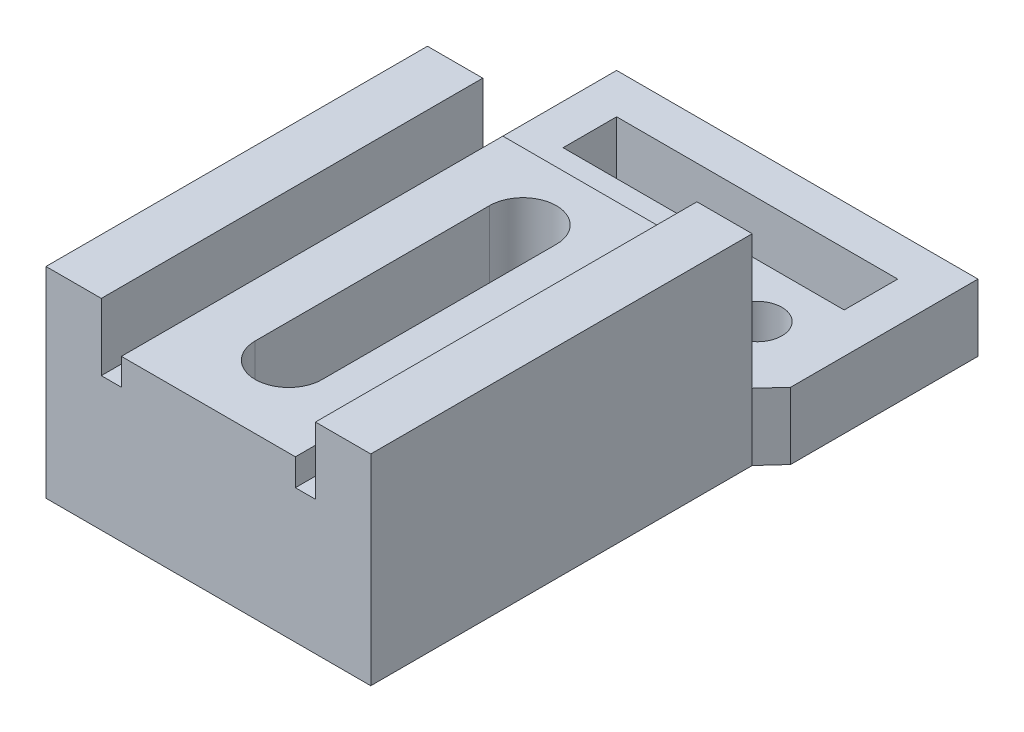
ISO-10303-21;
HEADER;
FILE_DESCRIPTION(('STEP AP214'),'2;1');
FILE_NAME('part.step','',(''),(''),'','','');
FILE_SCHEMA(('AUTOMOTIVE_DESIGN { 1 0 10303 214 1 1 1 1 }'));
ENDSEC;
DATA;
#1=APPLICATION_CONTEXT('core data for automotive mechanical design processes');
#2=APPLICATION_PROTOCOL_DEFINITION('international standard','automotive_design',2000,#1);
#3=PRODUCT_CONTEXT('',#1,'mechanical');
#4=PRODUCT('Part','Part','',(#3));
#5=PRODUCT_RELATED_PRODUCT_CATEGORY('part','',(#4));
#6=PRODUCT_DEFINITION_FORMATION('','',#4);
#7=PRODUCT_DEFINITION_CONTEXT('part definition',#1,'design');
#8=PRODUCT_DEFINITION('design','',#6,#7);
#9=PRODUCT_DEFINITION_SHAPE('','',#8);
#10=(LENGTH_UNIT() NAMED_UNIT(*) SI_UNIT(.MILLI.,.METRE.));
#11=(NAMED_UNIT(*) PLANE_ANGLE_UNIT() SI_UNIT($,.RADIAN.));
#12=(NAMED_UNIT(*) SI_UNIT($,.STERADIAN.) SOLID_ANGLE_UNIT());
#13=UNCERTAINTY_MEASURE_WITH_UNIT(LENGTH_MEASURE(1.E-05),#10,'distance_accuracy_value','');
#14=(GEOMETRIC_REPRESENTATION_CONTEXT(3) GLOBAL_UNCERTAINTY_ASSIGNED_CONTEXT((#13)) GLOBAL_UNIT_ASSIGNED_CONTEXT((#10,
#11,#12)) REPRESENTATION_CONTEXT('',''));
#15=CARTESIAN_POINT('',(0.,0.,0.));
#16=DIRECTION('',(0.,0.,1.));
#17=DIRECTION('',(1.,0.,0.));
#18=AXIS2_PLACEMENT_3D('',#15,#16,#17);
#19=CARTESIAN_POINT('',(4.501,-3.15116720260804,-78.1616330776864));
#20=DIRECTION('',(0.,0.,1.));
#21=DIRECTION('',(1.,0.,0.));
#22=AXIS2_PLACEMENT_3D('',#19,#20,#21);
#23=PLANE('',#22);
#24=DIRECTION('',(0.,1.,0.));
#25=VECTOR('',#24,1.);
#26=CARTESIAN_POINT('',(3.13183387502036,-36.8227277360133,-78.1616330776864));
#27=LINE('',#26,#25);
#28=CARTESIAN_POINT('',(3.13183387502036,-3.15116720260804,-78.1616330776864));
#29=VERTEX_POINT('',#28);
#30=CARTESIAN_POINT('',(3.13183387502036,6.84883279739195,-78.1616330776864));
#31=VERTEX_POINT('',#30);
#32=EDGE_CURVE('E233',#29,#31,#27,.T.);
#33=ORIENTED_EDGE('',*,*,#32,.F.);
#34=DIRECTION('',(-1.,0.,0.));
#35=VECTOR('',#34,1.);
#36=CARTESIAN_POINT('',(4.501,-3.15116720260804,-78.1616330776864));
#37=LINE('',#36,#35);
#38=CARTESIAN_POINT('',(-21.1318338750204,-3.15116720260804,-78.1616330776864));
#39=VERTEX_POINT('',#38);
#40=EDGE_CURVE('E59',#29,#39,#37,.T.);
#41=ORIENTED_EDGE('',*,*,#40,.T.);
#42=DIRECTION('',(0.,1.,0.));
#43=VECTOR('',#42,1.);
#44=CARTESIAN_POINT('',(-21.1318338750204,-36.8227277360133,-78.1616330776864));
#45=LINE('',#44,#43);
#46=CARTESIAN_POINT('',(-21.1318338750204,6.84883279739195,-78.1616330776864));
#47=VERTEX_POINT('',#46);
#48=EDGE_CURVE('E255',#39,#47,#45,.T.);
#49=ORIENTED_EDGE('',*,*,#48,.T.);
#50=DIRECTION('',(-1.,0.,0.));
#51=VECTOR('',#50,1.);
#52=CARTESIAN_POINT('',(4.501,6.84883279739196,-78.1616330776864));
#53=LINE('',#52,#51);
#54=CARTESIAN_POINT('',(-17.,6.84883279739196,-78.1616330776864));
#55=VERTEX_POINT('',#54);
#56=EDGE_CURVE('E263',#55,#47,#53,.T.);
#57=ORIENTED_EDGE('',*,*,#56,.F.);
#58=DIRECTION('',(0.,1.,0.));
#59=VECTOR('',#58,1.);
#60=CARTESIAN_POINT('',(-17.,-3.15116720260804,-78.1616330776864));
#61=LINE('',#60,#59);
#62=CARTESIAN_POINT('',(-17.,1.84883279739196,-78.1616330776864));
#63=VERTEX_POINT('',#62);
#64=EDGE_CURVE('E277',#63,#55,#61,.T.);
#65=ORIENTED_EDGE('',*,*,#64,.F.);
#66=DIRECTION('',(-1.,0.,0.));
#67=VECTOR('',#66,1.);
#68=CARTESIAN_POINT('',(-17.,1.84883279739196,-78.1616330776864));
#69=LINE('',#68,#67);
#70=CARTESIAN_POINT('',(-15.5,1.84883279739196,-78.1616330776864));
#71=VERTEX_POINT('',#70);
#72=EDGE_CURVE('E437',#71,#63,#69,.T.);
#73=ORIENTED_EDGE('',*,*,#72,.F.);
#74=DIRECTION('',(0.,1.,0.));
#75=VECTOR('',#74,1.);
#76=CARTESIAN_POINT('',(-15.5,1.84883279739196,-78.1616330776864));
#77=LINE('',#76,#75);
#78=CARTESIAN_POINT('',(-15.5,3.84883279739196,-78.1616330776864));
#79=VERTEX_POINT('',#78);
#80=EDGE_CURVE('E412',#71,#79,#77,.T.);
#81=ORIENTED_EDGE('',*,*,#80,.T.);
#82=DIRECTION('',(-1.,0.,0.));
#83=VECTOR('',#82,1.);
#84=CARTESIAN_POINT('',(4.501,3.84883279739196,-78.1616330776864));
#85=LINE('',#84,#83);
#86=CARTESIAN_POINT('',(-2.5,3.84883279739196,-78.1616330776864));
#87=VERTEX_POINT('',#86);
#88=EDGE_CURVE('E273',#87,#79,#85,.T.);
#89=ORIENTED_EDGE('',*,*,#88,.F.);
#90=DIRECTION('',(0.,1.,0.));
#91=VECTOR('',#90,1.);
#92=CARTESIAN_POINT('',(-2.5,1.84883279739196,-78.1616330776864));
#93=LINE('',#92,#91);
#94=CARTESIAN_POINT('',(-2.5,1.84883279739196,-78.1616330776864));
#95=VERTEX_POINT('',#94);
#96=EDGE_CURVE('E478',#95,#87,#93,.T.);
#97=ORIENTED_EDGE('',*,*,#96,.F.);
#98=DIRECTION('',(-1.,0.,0.));
#99=VECTOR('',#98,1.);
#100=CARTESIAN_POINT('',(-1.,1.84883279739196,-78.1616330776864));
#101=LINE('',#100,#99);
#102=CARTESIAN_POINT('',(-1.,1.84883279739196,-78.1616330776864));
#103=VERTEX_POINT('',#102);
#104=EDGE_CURVE('E465',#103,#95,#101,.T.);
#105=ORIENTED_EDGE('',*,*,#104,.F.);
#106=DIRECTION('',(0.,-1.,0.));
#107=VECTOR('',#106,1.);
#108=CARTESIAN_POINT('',(-1.,-3.15116720260804,-78.1616330776864));
#109=LINE('',#108,#107);
#110=CARTESIAN_POINT('',(-1.,6.84883279739196,-78.1616330776864));
#111=VERTEX_POINT('',#110);
#112=EDGE_CURVE('E270',#111,#103,#109,.T.);
#113=ORIENTED_EDGE('',*,*,#112,.F.);
#114=EDGE_CURVE('E267',#31,#111,#53,.T.);
#115=ORIENTED_EDGE('',*,*,#114,.F.);
#116=EDGE_LOOP('',(#33,#41,#49,#57,#65,#73,#81,#89,#97,#105,#113,#115));
#117=FACE_BOUND('',#116,.T.);
#118=ADVANCED_FACE('F43',(#117),#23,.F.);
#119=CARTESIAN_POINT('',(-1.,3.84883279739196,-79.6616330776864));
#120=DIRECTION('',(0.,1.,0.));
#121=DIRECTION('',(-1.,0.,0.));
#122=AXIS2_PLACEMENT_3D('',#119,#120,#121);
#123=PLANE('',#122);
#124=DIRECTION('',(0.,0.,-1.));
#125=VECTOR('',#124,1.);
#126=CARTESIAN_POINT('',(-15.5,3.84883279739196,-78.1616330776864));
#127=LINE('',#126,#125);
#128=CARTESIAN_POINT('',(-15.5,3.84883279739196,-49.6616330776864));
#129=VERTEX_POINT('',#128);
#130=EDGE_CURVE('E439',#129,#79,#127,.T.);
#131=ORIENTED_EDGE('',*,*,#130,.F.);
#132=DIRECTION('',(-1.,0.,0.));
#133=VECTOR('',#132,1.);
#134=CARTESIAN_POINT('',(-1.,3.84883279739196,-49.6616330776864));
#135=LINE('',#134,#133);
#136=CARTESIAN_POINT('',(-2.5,3.84883279739196,-49.6616330776864));
#137=VERTEX_POINT('',#136);
#138=EDGE_CURVE('E383',#137,#129,#135,.T.);
#139=ORIENTED_EDGE('',*,*,#138,.F.);
#140=DIRECTION('',(0.,0.,1.));
#141=VECTOR('',#140,1.);
#142=CARTESIAN_POINT('',(-2.5,3.84883279739196,-78.1616330776864));
#143=LINE('',#142,#141);
#144=EDGE_CURVE('E466',#87,#137,#143,.T.);
#145=ORIENTED_EDGE('',*,*,#144,.F.);
#146=ORIENTED_EDGE('',*,*,#88,.T.);
#147=EDGE_LOOP('',(#131,#139,#145,#146));
#148=FACE_BOUND('',#147,.T.);
#149=CARTESIAN_POINT('',(-9.,3.84883279739196,-55.6616330776864));
#150=DIRECTION('',(0.,1.,0.));
#151=DIRECTION('',(-1.,0.,0.));
#152=AXIS2_PLACEMENT_3D('',#149,#150,#151);
#153=CIRCLE('',#152,2.5);
#154=CARTESIAN_POINT('',(-6.5,3.84883279739196,-55.6616330776864));
#155=VERTEX_POINT('',#154);
#156=CARTESIAN_POINT('',(-11.5,3.84883279739196,-55.6616330776864));
#157=VERTEX_POINT('',#156);
#158=EDGE_CURVE('E586',#155,#157,#153,.F.);
#159=ORIENTED_EDGE('',*,*,#158,.T.);
#160=DIRECTION('',(0.,0.,1.));
#161=VECTOR('',#160,1.);
#162=CARTESIAN_POINT('',(-11.5,3.84883279739196,-79.6616330776864));
#163=LINE('',#162,#161);
#164=CARTESIAN_POINT('',(-11.5,3.84883279739196,-73.1616330776864));
#165=VERTEX_POINT('',#164);
#166=EDGE_CURVE('E448',#165,#157,#163,.T.);
#167=ORIENTED_EDGE('',*,*,#166,.F.);
#168=CARTESIAN_POINT('',(-9.,3.84883279739196,-73.1616330776864));
#169=DIRECTION('',(0.,1.,0.));
#170=DIRECTION('',(0.,0.,1.));
#171=AXIS2_PLACEMENT_3D('',#168,#169,#170);
#172=CIRCLE('',#171,2.5);
#173=CARTESIAN_POINT('',(-6.5,3.84883279739196,-73.1616330776864));
#174=VERTEX_POINT('',#173);
#175=EDGE_CURVE('E379',#174,#165,#172,.T.);
#176=ORIENTED_EDGE('',*,*,#175,.F.);
#177=DIRECTION('',(0.,0.,-1.));
#178=VECTOR('',#177,1.);
#179=CARTESIAN_POINT('',(-6.5,3.84883279739196,-79.6616330776864));
#180=LINE('',#179,#178);
#181=EDGE_CURVE('E603',#155,#174,#180,.T.);
#182=ORIENTED_EDGE('',*,*,#181,.F.);
#183=EDGE_LOOP('',(#159,#167,#176,#182));
#184=FACE_BOUND('',#183,.T.);
#185=ADVANCED_FACE('F493',(#148,#184),#123,.T.);
#186=CARTESIAN_POINT('',(0.,-8.15116720260804,0.));
#187=DIRECTION('',(0.,-1.,0.));
#188=DIRECTION('',(0.,0.,-1.));
#189=AXIS2_PLACEMENT_3D('',#186,#187,#188);
#190=PLANE('',#189);
#191=DIRECTION('',(0.673893454236287,0.,-0.738828540554224));
#192=VECTOR('',#191,1.);
#193=CARTESIAN_POINT('',(3.13183387502036,-8.15116720260804,-78.1616330776864));
#194=LINE('',#193,#192);
#195=CARTESIAN_POINT('',(3.13183387502036,-8.15116720260804,-78.1616330776864));
#196=VERTEX_POINT('',#195);
#197=CARTESIAN_POINT('',(4.5,-8.15116720260804,-79.6616330776864));
#198=VERTEX_POINT('',#197);
#199=EDGE_CURVE('E212',#196,#198,#194,.T.);
#200=ORIENTED_EDGE('',*,*,#199,.F.);
#201=DIRECTION('',(0.,0.,-1.));
#202=VECTOR('',#201,1.);
#203=CARTESIAN_POINT('',(3.13183387502036,-8.15116720260804,-49.6616330776864));
#204=LINE('',#203,#202);
#205=CARTESIAN_POINT('',(3.13183387502036,-8.15116720260804,-49.6616330776864));
#206=VERTEX_POINT('',#205);
#207=EDGE_CURVE('E217',#206,#196,#204,.T.);
#208=ORIENTED_EDGE('',*,*,#207,.F.);
#209=DIRECTION('',(-1.,0.,0.));
#210=VECTOR('',#209,1.);
#211=CARTESIAN_POINT('',(0.,-8.15116720260804,-49.6616330776864));
#212=LINE('',#211,#210);
#213=CARTESIAN_POINT('',(-21.1318338750204,-8.15116720260804,-49.6616330776864));
#214=VERTEX_POINT('',#213);
#215=EDGE_CURVE('E334',#206,#214,#212,.T.);
#216=ORIENTED_EDGE('',*,*,#215,.T.);
#217=DIRECTION('',(0.,0.,-1.));
#218=VECTOR('',#217,1.);
#219=CARTESIAN_POINT('',(-21.1318338750204,-8.15116720260804,-49.6616330776864));
#220=LINE('',#219,#218);
#221=CARTESIAN_POINT('',(-21.1318338750204,-8.15116720260804,-78.1616330776864));
#222=VERTEX_POINT('',#221);
#223=EDGE_CURVE('E244',#214,#222,#220,.T.);
#224=ORIENTED_EDGE('',*,*,#223,.T.);
#225=DIRECTION('',(0.673893454236287,0.,0.738828540554224));
#226=VECTOR('',#225,1.);
#227=CARTESIAN_POINT('',(-21.1318338750204,-8.15116720260804,-78.1616330776864));
#228=LINE('',#227,#226);
#229=CARTESIAN_POINT('',(-22.5,-8.15116720260804,-79.6616330776864));
#230=VERTEX_POINT('',#229);
#231=EDGE_CURVE('E576',#230,#222,#228,.T.);
#232=ORIENTED_EDGE('',*,*,#231,.F.);
#233=DIRECTION('',(0.,0.,1.));
#234=VECTOR('',#233,1.);
#235=CARTESIAN_POINT('',(-22.5,-8.15116720260804,0.));
#236=LINE('',#235,#234);
#237=CARTESIAN_POINT('',(-22.5,-8.15116720260804,-93.6616330776864));
#238=VERTEX_POINT('',#237);
#239=EDGE_CURVE('E325',#238,#230,#236,.T.);
#240=ORIENTED_EDGE('',*,*,#239,.F.);
#241=DIRECTION('',(1.,0.,0.));
#242=VECTOR('',#241,1.);
#243=CARTESIAN_POINT('',(0.,-8.15116720260804,-93.6616330776864));
#244=LINE('',#243,#242);
#245=CARTESIAN_POINT('',(4.5,-8.15116720260804,-93.6616330776864));
#246=VERTEX_POINT('',#245);
#247=EDGE_CURVE('E328',#238,#246,#244,.T.);
#248=ORIENTED_EDGE('',*,*,#247,.T.);
#249=DIRECTION('',(0.,0.,1.));
#250=VECTOR('',#249,1.);
#251=CARTESIAN_POINT('',(4.5,-8.15116720260804,0.));
#252=LINE('',#251,#250);
#253=EDGE_CURVE('E220',#246,#198,#252,.T.);
#254=ORIENTED_EDGE('',*,*,#253,.T.);
#255=EDGE_LOOP('',(#200,#208,#216,#224,#232,#240,#248,#254));
#256=FACE_BOUND('',#255,.T.);
#257=DIRECTION('',(0.,0.,1.));
#258=VECTOR('',#257,1.);
#259=CARTESIAN_POINT('',(1.5,-8.15116720260804,-86.6616330776864));
#260=LINE('',#259,#258);
#261=CARTESIAN_POINT('',(1.5,-8.15116720260804,-90.6616330776864));
#262=VERTEX_POINT('',#261);
#263=CARTESIAN_POINT('',(1.5,-8.15116720260804,-86.6616330776864));
#264=VERTEX_POINT('',#263);
#265=EDGE_CURVE('E292',#262,#264,#260,.T.);
#266=ORIENTED_EDGE('',*,*,#265,.F.);
#267=DIRECTION('',(1.,0.,0.));
#268=VECTOR('',#267,1.);
#269=CARTESIAN_POINT('',(1.5,-8.15116720260804,-90.6616330776864));
#270=LINE('',#269,#268);
#271=CARTESIAN_POINT('',(-19.5,-8.15116720260804,-90.6616330776864));
#272=VERTEX_POINT('',#271);
#273=EDGE_CURVE('E303',#272,#262,#270,.T.);
#274=ORIENTED_EDGE('',*,*,#273,.F.);
#275=DIRECTION('',(0.,0.,-1.));
#276=VECTOR('',#275,1.);
#277=CARTESIAN_POINT('',(-19.5,-8.15116720260804,-90.6616330776864));
#278=LINE('',#277,#276);
#279=CARTESIAN_POINT('',(-19.5,-8.15116720260804,-86.6616330776864));
#280=VERTEX_POINT('',#279);
#281=EDGE_CURVE('E299',#280,#272,#278,.T.);
#282=ORIENTED_EDGE('',*,*,#281,.F.);
#283=DIRECTION('',(-1.,0.,0.));
#284=VECTOR('',#283,1.);
#285=CARTESIAN_POINT('',(-19.5,-8.15116720260804,-86.6616330776864));
#286=LINE('',#285,#284);
#287=EDGE_CURVE('E295',#264,#280,#286,.T.);
#288=ORIENTED_EDGE('',*,*,#287,.F.);
#289=EDGE_LOOP('',(#266,#274,#282,#288));
#290=FACE_BOUND('',#289,.T.);
#291=CARTESIAN_POINT('',(-17.,-8.15116720260804,-82.6616330776864));
#292=DIRECTION('',(0.,-1.,0.));
#293=DIRECTION('',(0.,0.,-1.));
#294=AXIS2_PLACEMENT_3D('',#291,#292,#293);
#295=CIRCLE('',#294,1.85000000000001);
#296=CARTESIAN_POINT('',(-17.,-8.15116720260804,-84.5116330776864));
#297=VERTEX_POINT('',#296);
#298=EDGE_CURVE('E341',#297,#297,#295,.T.);
#299=ORIENTED_EDGE('',*,*,#298,.F.);
#300=EDGE_LOOP('',(#299));
#301=FACE_BOUND('',#300,.T.);
#302=CARTESIAN_POINT('',(-1.,-8.15116720260804,-82.6616330776864));
#303=DIRECTION('',(0.,-1.,0.));
#304=DIRECTION('',(0.,0.,-1.));
#305=AXIS2_PLACEMENT_3D('',#302,#303,#304);
#306=CIRCLE('',#305,1.85);
#307=CARTESIAN_POINT('',(-1.,-8.15116720260804,-84.5116330776864));
#308=VERTEX_POINT('',#307);
#309=EDGE_CURVE('E345',#308,#308,#306,.F.);
#310=ORIENTED_EDGE('',*,*,#309,.T.);
#311=EDGE_LOOP('',(#310));
#312=FACE_BOUND('',#311,.T.);
#313=DIRECTION('',(0.,0.,-1.));
#314=VECTOR('',#313,1.);
#315=CARTESIAN_POINT('',(-11.5,-8.15116720260804,-79.6616330776864));
#316=LINE('',#315,#314);
#317=CARTESIAN_POINT('',(-11.5,-8.15116720260804,-55.6616330776864));
#318=VERTEX_POINT('',#317);
#319=CARTESIAN_POINT('',(-11.5,-8.15116720260804,-73.1616330776864));
#320=VERTEX_POINT('',#319);
#321=EDGE_CURVE('E608',#318,#320,#316,.T.);
#322=ORIENTED_EDGE('',*,*,#321,.F.);
#323=CARTESIAN_POINT('',(-9.,-8.15116720260804,-55.6616330776864));
#324=DIRECTION('',(0.,-1.,0.));
#325=DIRECTION('',(0.,0.,-1.));
#326=AXIS2_PLACEMENT_3D('',#323,#324,#325);
#327=CIRCLE('',#326,2.5);
#328=CARTESIAN_POINT('',(-6.5,-8.15116720260804,-55.6616330776864));
#329=VERTEX_POINT('',#328);
#330=EDGE_CURVE('E579',#318,#329,#327,.F.);
#331=ORIENTED_EDGE('',*,*,#330,.T.);
#332=DIRECTION('',(0.,0.,1.));
#333=VECTOR('',#332,1.);
#334=CARTESIAN_POINT('',(-6.5,-8.15116720260804,-79.6616330776864));
#335=LINE('',#334,#333);
#336=CARTESIAN_POINT('',(-6.5,-8.15116720260804,-73.1616330776864));
#337=VERTEX_POINT('',#336);
#338=EDGE_CURVE('E598',#337,#329,#335,.T.);
#339=ORIENTED_EDGE('',*,*,#338,.F.);
#340=CARTESIAN_POINT('',(-9.,-8.15116720260804,-73.1616330776864));
#341=DIRECTION('',(0.,-1.,0.));
#342=DIRECTION('',(0.,0.,-1.));
#343=AXIS2_PLACEMENT_3D('',#340,#341,#342);
#344=CIRCLE('',#343,2.5);
#345=EDGE_CURVE('E337',#337,#320,#344,.F.);
#346=ORIENTED_EDGE('',*,*,#345,.T.);
#347=EDGE_LOOP('',(#322,#331,#339,#346));
#348=FACE_BOUND('',#347,.T.);
#349=ADVANCED_FACE('F214',(#256,#290,#301,#312,#348),#190,.T.);
#350=CARTESIAN_POINT('',(-18.,6.84883279739196,-49.6616330776864));
#351=DIRECTION('',(0.,0.,1.));
#352=DIRECTION('',(1.,0.,0.));
#353=AXIS2_PLACEMENT_3D('',#350,#351,#352);
#354=PLANE('',#353);
#355=DIRECTION('',(1.,0.,0.));
#356=VECTOR('',#355,1.);
#357=CARTESIAN_POINT('',(-17.,1.84883279739196,-49.6616330776864));
#358=LINE('',#357,#356);
#359=CARTESIAN_POINT('',(-17.,1.84883279739196,-49.6616330776864));
#360=VERTEX_POINT('',#359);
#361=CARTESIAN_POINT('',(-15.5,1.84883279739196,-49.6616330776864));
#362=VERTEX_POINT('',#361);
#363=EDGE_CURVE('E428',#360,#362,#358,.T.);
#364=ORIENTED_EDGE('',*,*,#363,.F.);
#365=DIRECTION('',(0.,1.,0.));
#366=VECTOR('',#365,1.);
#367=CARTESIAN_POINT('',(-17.,3.84883279739196,-49.6616330776864));
#368=LINE('',#367,#366);
#369=CARTESIAN_POINT('',(-17.,6.84883279739196,-49.6616330776864));
#370=VERTEX_POINT('',#369);
#371=EDGE_CURVE('E387',#360,#370,#368,.T.);
#372=ORIENTED_EDGE('',*,*,#371,.T.);
#373=DIRECTION('',(1.,0.,0.));
#374=VECTOR('',#373,1.);
#375=CARTESIAN_POINT('',(-18.,6.84883279739196,-49.6616330776864));
#376=LINE('',#375,#374);
#377=CARTESIAN_POINT('',(-21.1318338750204,6.84883279739195,-49.6616330776864));
#378=VERTEX_POINT('',#377);
#379=EDGE_CURVE('E11',#378,#370,#376,.T.);
#380=ORIENTED_EDGE('',*,*,#379,.F.);
#381=DIRECTION('',(0.,1.,0.));
#382=VECTOR('',#381,1.);
#383=CARTESIAN_POINT('',(-21.1318338750204,-36.8227277360133,-49.6616330776864));
#384=LINE('',#383,#382);
#385=EDGE_CURVE('E252',#214,#378,#384,.T.);
#386=ORIENTED_EDGE('',*,*,#385,.F.);
#387=ORIENTED_EDGE('',*,*,#215,.F.);
#388=DIRECTION('',(0.,1.,0.));
#389=VECTOR('',#388,1.);
#390=CARTESIAN_POINT('',(3.13183387502036,-36.8227277360133,-49.6616330776864));
#391=LINE('',#390,#389);
#392=CARTESIAN_POINT('',(3.13183387502036,6.84883279739195,-49.6616330776864));
#393=VERTEX_POINT('',#392);
#394=EDGE_CURVE('E238',#206,#393,#391,.T.);
#395=ORIENTED_EDGE('',*,*,#394,.T.);
#396=CARTESIAN_POINT('',(-1.,6.84883279739196,-49.6616330776864));
#397=VERTEX_POINT('',#396);
#398=EDGE_CURVE('E52',#397,#393,#376,.T.);
#399=ORIENTED_EDGE('',*,*,#398,.F.);
#400=DIRECTION('',(0.,-1.,0.));
#401=VECTOR('',#400,1.);
#402=CARTESIAN_POINT('',(-1.,6.84883279739196,-49.6616330776864));
#403=LINE('',#402,#401);
#404=CARTESIAN_POINT('',(-1.,1.84883279739196,-49.6616330776864));
#405=VERTEX_POINT('',#404);
#406=EDGE_CURVE('E391',#397,#405,#403,.T.);
#407=ORIENTED_EDGE('',*,*,#406,.T.);
#408=DIRECTION('',(1.,0.,0.));
#409=VECTOR('',#408,1.);
#410=CARTESIAN_POINT('',(-1.,1.84883279739196,-49.6616330776864));
#411=LINE('',#410,#409);
#412=CARTESIAN_POINT('',(-2.5,1.84883279739196,-49.6616330776864));
#413=VERTEX_POINT('',#412);
#414=EDGE_CURVE('E474',#413,#405,#411,.T.);
#415=ORIENTED_EDGE('',*,*,#414,.F.);
#416=DIRECTION('',(0.,1.,0.));
#417=VECTOR('',#416,1.);
#418=CARTESIAN_POINT('',(-2.5,1.84883279739196,-49.6616330776864));
#419=LINE('',#418,#417);
#420=EDGE_CURVE('E445',#413,#137,#419,.T.);
#421=ORIENTED_EDGE('',*,*,#420,.T.);
#422=ORIENTED_EDGE('',*,*,#138,.T.);
#423=DIRECTION('',(0.,1.,0.));
#424=VECTOR('',#423,1.);
#425=CARTESIAN_POINT('',(-15.5,1.84883279739196,-49.6616330776864));
#426=LINE('',#425,#424);
#427=EDGE_CURVE('E454',#362,#129,#426,.T.);
#428=ORIENTED_EDGE('',*,*,#427,.F.);
#429=EDGE_LOOP('',(#364,#372,#380,#386,#387,#395,#399,#407,#415,#421,#422,#428));
#430=FACE_BOUND('',#429,.T.);
#431=ADVANCED_FACE('F409',(#430),#354,.T.);
#432=CARTESIAN_POINT('',(-18.,6.84883279739196,-79.6616330776864));
#433=DIRECTION('',(0.,1.,0.));
#434=DIRECTION('',(0.,0.,1.));
#435=AXIS2_PLACEMENT_3D('',#432,#433,#434);
#436=PLANE('',#435);
#437=ORIENTED_EDGE('',*,*,#56,.T.);
#438=DIRECTION('',(0.,0.,-1.));
#439=VECTOR('',#438,1.);
#440=CARTESIAN_POINT('',(-21.1318338750204,6.84883279739195,-49.6616330776864));
#441=LINE('',#440,#439);
#442=EDGE_CURVE('E248',#378,#47,#441,.T.);
#443=ORIENTED_EDGE('',*,*,#442,.F.);
#444=ORIENTED_EDGE('',*,*,#379,.T.);
#445=DIRECTION('',(0.,0.,1.));
#446=VECTOR('',#445,1.);
#447=CARTESIAN_POINT('',(-17.,6.84883279739196,-79.6616330776864));
#448=LINE('',#447,#446);
#449=EDGE_CURVE('E396',#55,#370,#448,.T.);
#450=ORIENTED_EDGE('',*,*,#449,.F.);
#451=EDGE_LOOP('',(#437,#443,#444,#450));
#452=FACE_BOUND('',#451,.T.);
#453=ADVANCED_FACE('F45',(#452),#436,.T.);
#454=ORIENTED_EDGE('',*,*,#114,.T.);
#455=DIRECTION('',(0.,0.,1.));
#456=VECTOR('',#455,1.);
#457=CARTESIAN_POINT('',(-1.,6.84883279739196,-79.6616330776864));
#458=LINE('',#457,#456);
#459=EDGE_CURVE('E394',#111,#397,#458,.T.);
#460=ORIENTED_EDGE('',*,*,#459,.T.);
#461=ORIENTED_EDGE('',*,*,#398,.T.);
#462=DIRECTION('',(0.,0.,-1.));
#463=VECTOR('',#462,1.);
#464=CARTESIAN_POINT('',(3.13183387502036,6.84883279739195,-49.6616330776864));
#465=LINE('',#464,#463);
#466=EDGE_CURVE('E240',#393,#31,#465,.T.);
#467=ORIENTED_EDGE('',*,*,#466,.T.);
#468=EDGE_LOOP('',(#454,#460,#461,#467));
#469=FACE_BOUND('',#468,.T.);
#470=ADVANCED_FACE('F404',(#469),#436,.T.);
#471=CARTESIAN_POINT('',(-17.,3.84883279739196,-79.6616330776864));
#472=DIRECTION('',(1.,0.,0.));
#473=DIRECTION('',(0.,0.,-1.));
#474=AXIS2_PLACEMENT_3D('',#471,#472,#473);
#475=PLANE('',#474);
#476=ORIENTED_EDGE('',*,*,#64,.T.);
#477=ORIENTED_EDGE('',*,*,#449,.T.);
#478=ORIENTED_EDGE('',*,*,#371,.F.);
#479=DIRECTION('',(0.,0.,1.));
#480=VECTOR('',#479,1.);
#481=CARTESIAN_POINT('',(-17.,1.84883279739196,-78.1616330776864));
#482=LINE('',#481,#480);
#483=EDGE_CURVE('E432',#63,#360,#482,.T.);
#484=ORIENTED_EDGE('',*,*,#483,.F.);
#485=EDGE_LOOP('',(#476,#477,#478,#484));
#486=FACE_BOUND('',#485,.T.);
#487=ADVANCED_FACE('F431',(#486),#475,.T.);
#488=CARTESIAN_POINT('',(-1.,6.84883279739196,-79.6616330776864));
#489=DIRECTION('',(-1.,0.,0.));
#490=DIRECTION('',(0.,0.,1.));
#491=AXIS2_PLACEMENT_3D('',#488,#489,#490);
#492=PLANE('',#491);
#493=ORIENTED_EDGE('',*,*,#112,.T.);
#494=DIRECTION('',(0.,0.,-1.));
#495=VECTOR('',#494,1.);
#496=CARTESIAN_POINT('',(-1.,1.84883279739196,-78.1616330776864));
#497=LINE('',#496,#495);
#498=EDGE_CURVE('E461',#405,#103,#497,.T.);
#499=ORIENTED_EDGE('',*,*,#498,.F.);
#500=ORIENTED_EDGE('',*,*,#406,.F.);
#501=ORIENTED_EDGE('',*,*,#459,.F.);
#502=EDGE_LOOP('',(#493,#499,#500,#501));
#503=FACE_BOUND('',#502,.T.);
#504=ADVANCED_FACE('F503',(#503),#492,.T.);
#505=CARTESIAN_POINT('',(-9.,3.84883279739196,-73.1616330776864));
#506=DIRECTION('',(0.,1.,0.));
#507=DIRECTION('',(0.,0.,1.));
#508=AXIS2_PLACEMENT_3D('',#505,#506,#507);
#509=CYLINDRICAL_SURFACE('',#508,2.5);
#510=ORIENTED_EDGE('',*,*,#175,.T.);
#511=DIRECTION('',(0.,1.,0.));
#512=VECTOR('',#511,1.);
#513=CARTESIAN_POINT('',(-11.5,-8.15216720260804,-73.1616330776864));
#514=LINE('',#513,#512);
#515=EDGE_CURVE('E606',#320,#165,#514,.T.);
#516=ORIENTED_EDGE('',*,*,#515,.F.);
#517=ORIENTED_EDGE('',*,*,#345,.F.);
#518=DIRECTION('',(0.,1.,0.));
#519=VECTOR('',#518,1.);
#520=CARTESIAN_POINT('',(-6.5,3.84883279739196,-73.1616330776864));
#521=LINE('',#520,#519);
#522=EDGE_CURVE('E67',#337,#174,#521,.T.);
#523=ORIENTED_EDGE('',*,*,#522,.T.);
#524=EDGE_LOOP('',(#510,#516,#517,#523));
#525=FACE_BOUND('',#524,.T.);
#526=ADVANCED_FACE('F505',(#525),#509,.F.);
#527=CARTESIAN_POINT('',(0.,-3.15116720260804,0.));
#528=DIRECTION('',(0.,-1.,0.));
#529=DIRECTION('',(0.,0.,-1.));
#530=AXIS2_PLACEMENT_3D('',#527,#528,#529);
#531=PLANE('',#530);
#532=ORIENTED_EDGE('',*,*,#40,.F.);
#533=DIRECTION('',(0.673893454236287,0.,-0.738828540554224));
#534=VECTOR('',#533,1.);
#535=CARTESIAN_POINT('',(3.13183387502036,-3.15116720260804,-78.1616330776864));
#536=LINE('',#535,#534);
#537=CARTESIAN_POINT('',(4.49999999999999,-3.15116720260804,-79.6616330776864));
#538=VERTEX_POINT('',#537);
#539=EDGE_CURVE('E225',#29,#538,#536,.T.);
#540=ORIENTED_EDGE('',*,*,#539,.T.);
#541=DIRECTION('',(0.,0.,1.));
#542=VECTOR('',#541,1.);
#543=CARTESIAN_POINT('',(4.5,-3.15116720260804,0.));
#544=LINE('',#543,#542);
#545=CARTESIAN_POINT('',(4.5,-3.15116720260804,-93.6616330776864));
#546=VERTEX_POINT('',#545);
#547=EDGE_CURVE('E356',#546,#538,#544,.T.);
#548=ORIENTED_EDGE('',*,*,#547,.F.);
#549=DIRECTION('',(1.,0.,0.));
#550=VECTOR('',#549,1.);
#551=CARTESIAN_POINT('',(0.,-3.15116720260804,-93.6616330776864));
#552=LINE('',#551,#550);
#553=CARTESIAN_POINT('',(-22.5,-3.15116720260804,-93.6616330776864));
#554=VERTEX_POINT('',#553);
#555=EDGE_CURVE('E353',#554,#546,#552,.T.);
#556=ORIENTED_EDGE('',*,*,#555,.F.);
#557=DIRECTION('',(0.,0.,1.));
#558=VECTOR('',#557,1.);
#559=CARTESIAN_POINT('',(-22.5,-3.15116720260804,0.));
#560=LINE('',#559,#558);
#561=CARTESIAN_POINT('',(-22.5,-3.15116720260804,-79.6616330776864));
#562=VERTEX_POINT('',#561);
#563=EDGE_CURVE('E324',#554,#562,#560,.T.);
#564=ORIENTED_EDGE('',*,*,#563,.T.);
#565=DIRECTION('',(0.673893454236287,0.,0.738828540554224));
#566=VECTOR('',#565,1.);
#567=CARTESIAN_POINT('',(-21.1318338750204,-3.15116720260804,-78.1616330776864));
#568=LINE('',#567,#566);
#569=EDGE_CURVE('E224',#562,#39,#568,.T.);
#570=ORIENTED_EDGE('',*,*,#569,.T.);
#571=EDGE_LOOP('',(#532,#540,#548,#556,#564,#570));
#572=FACE_BOUND('',#571,.T.);
#573=DIRECTION('',(-1.,0.,0.));
#574=VECTOR('',#573,1.);
#575=CARTESIAN_POINT('',(1.5,-3.15116720260804,-90.6616330776864));
#576=LINE('',#575,#574);
#577=CARTESIAN_POINT('',(1.5,-3.15116720260804,-90.6616330776864));
#578=VERTEX_POINT('',#577);
#579=CARTESIAN_POINT('',(-19.5,-3.15116720260804,-90.6616330776864));
#580=VERTEX_POINT('',#579);
#581=EDGE_CURVE('E284',#578,#580,#576,.T.);
#582=ORIENTED_EDGE('',*,*,#581,.F.);
#583=DIRECTION('',(0.,0.,-1.));
#584=VECTOR('',#583,1.);
#585=CARTESIAN_POINT('',(1.5,-3.15116720260804,-86.6616330776864));
#586=LINE('',#585,#584);
#587=CARTESIAN_POINT('',(1.49999999999999,-3.15116720260804,-86.6616330776864));
#588=VERTEX_POINT('',#587);
#589=EDGE_CURVE('E288',#588,#578,#586,.T.);
#590=ORIENTED_EDGE('',*,*,#589,.F.);
#591=DIRECTION('',(1.,0.,0.));
#592=VECTOR('',#591,1.);
#593=CARTESIAN_POINT('',(-19.5,-3.15116720260804,-86.6616330776864));
#594=LINE('',#593,#592);
#595=CARTESIAN_POINT('',(-19.5,-3.15116720260804,-86.6616330776864));
#596=VERTEX_POINT('',#595);
#597=EDGE_CURVE('E311',#596,#588,#594,.T.);
#598=ORIENTED_EDGE('',*,*,#597,.F.);
#599=DIRECTION('',(0.,0.,1.));
#600=VECTOR('',#599,1.);
#601=CARTESIAN_POINT('',(-19.5,-3.15116720260804,-90.6616330776864));
#602=LINE('',#601,#600);
#603=EDGE_CURVE('E281',#580,#596,#602,.T.);
#604=ORIENTED_EDGE('',*,*,#603,.F.);
#605=EDGE_LOOP('',(#582,#590,#598,#604));
#606=FACE_BOUND('',#605,.T.);
#607=CARTESIAN_POINT('',(-1.,-3.15116720260804,-82.6616330776864));
#608=DIRECTION('',(0.,-1.,0.));
#609=DIRECTION('',(0.,0.,-1.));
#610=AXIS2_PLACEMENT_3D('',#607,#608,#609);
#611=CIRCLE('',#610,1.85);
#612=CARTESIAN_POINT('',(-1.,-3.15116720260804,-84.5116330776864));
#613=VERTEX_POINT('',#612);
#614=EDGE_CURVE('E329',#613,#613,#611,.F.);
#615=ORIENTED_EDGE('',*,*,#614,.F.);
#616=EDGE_LOOP('',(#615));
#617=FACE_BOUND('',#616,.T.);
#618=CARTESIAN_POINT('',(-17.,-3.15116720260804,-82.6616330776864));
#619=DIRECTION('',(0.,-1.,0.));
#620=DIRECTION('',(0.,0.,-1.));
#621=AXIS2_PLACEMENT_3D('',#618,#619,#620);
#622=CIRCLE('',#621,1.85000000000001);
#623=CARTESIAN_POINT('',(-17.,-3.15116720260804,-84.5116330776864));
#624=VERTEX_POINT('',#623);
#625=EDGE_CURVE('E360',#624,#624,#622,.T.);
#626=ORIENTED_EDGE('',*,*,#625,.T.);
#627=EDGE_LOOP('',(#626));
#628=FACE_BOUND('',#627,.T.);
#629=ADVANCED_FACE('F511',(#572,#606,#617,#628),#531,.F.);
#630=CARTESIAN_POINT('',(-22.5,-8.15116720260804,0.));
#631=DIRECTION('',(-1.,0.,0.));
#632=DIRECTION('',(0.,0.,1.));
#633=AXIS2_PLACEMENT_3D('',#630,#631,#632);
#634=PLANE('',#633);
#635=ORIENTED_EDGE('',*,*,#563,.F.);
#636=DIRECTION('',(0.,1.,0.));
#637=VECTOR('',#636,1.);
#638=CARTESIAN_POINT('',(-22.5,-8.15116720260804,-93.6616330776864));
#639=LINE('',#638,#637);
#640=EDGE_CURVE('E373',#238,#554,#639,.T.);
#641=ORIENTED_EDGE('',*,*,#640,.F.);
#642=ORIENTED_EDGE('',*,*,#239,.T.);
#643=DIRECTION('',(0.,1.,0.));
#644=VECTOR('',#643,1.);
#645=CARTESIAN_POINT('',(-22.5,-8.15116720260804,-79.6616330776864));
#646=LINE('',#645,#644);
#647=EDGE_CURVE('E376',#230,#562,#646,.T.);
#648=ORIENTED_EDGE('',*,*,#647,.T.);
#649=EDGE_LOOP('',(#635,#641,#642,#648));
#650=FACE_BOUND('',#649,.T.);
#651=ADVANCED_FACE('F545',(#650),#634,.T.);
#652=CARTESIAN_POINT('',(0.,-8.15116720260804,-93.6616330776864));
#653=DIRECTION('',(0.,0.,1.));
#654=DIRECTION('',(1.,0.,0.));
#655=AXIS2_PLACEMENT_3D('',#652,#653,#654);
#656=PLANE('',#655);
#657=ORIENTED_EDGE('',*,*,#555,.T.);
#658=DIRECTION('',(0.,1.,0.));
#659=VECTOR('',#658,1.);
#660=CARTESIAN_POINT('',(4.5,-8.15116720260804,-93.6616330776864));
#661=LINE('',#660,#659);
#662=EDGE_CURVE('E369',#246,#546,#661,.T.);
#663=ORIENTED_EDGE('',*,*,#662,.F.);
#664=ORIENTED_EDGE('',*,*,#247,.F.);
#665=ORIENTED_EDGE('',*,*,#640,.T.);
#666=EDGE_LOOP('',(#657,#663,#664,#665));
#667=FACE_BOUND('',#666,.T.);
#668=ADVANCED_FACE('F556',(#667),#656,.F.);
#669=CARTESIAN_POINT('',(4.5,-8.15116720260804,0.));
#670=DIRECTION('',(-1.,0.,0.));
#671=DIRECTION('',(0.,0.,1.));
#672=AXIS2_PLACEMENT_3D('',#669,#670,#671);
#673=PLANE('',#672);
#674=ORIENTED_EDGE('',*,*,#547,.T.);
#675=DIRECTION('',(0.,1.,0.));
#676=VECTOR('',#675,1.);
#677=CARTESIAN_POINT('',(4.5,-8.15116720260804,-79.6616330776864));
#678=LINE('',#677,#676);
#679=EDGE_CURVE('E349',#198,#538,#678,.T.);
#680=ORIENTED_EDGE('',*,*,#679,.F.);
#681=ORIENTED_EDGE('',*,*,#253,.F.);
#682=ORIENTED_EDGE('',*,*,#662,.T.);
#683=EDGE_LOOP('',(#674,#680,#681,#682));
#684=FACE_BOUND('',#683,.T.);
#685=ADVANCED_FACE('F552',(#684),#673,.F.);
#686=CARTESIAN_POINT('',(-17.,-8.15116720260804,-82.6616330776864));
#687=DIRECTION('',(0.,1.,0.));
#688=DIRECTION('',(0.,0.,1.));
#689=AXIS2_PLACEMENT_3D('',#686,#687,#688);
#690=CYLINDRICAL_SURFACE('',#689,1.85000000000001);
#691=ORIENTED_EDGE('',*,*,#298,.T.);
#692=EDGE_LOOP('',(#691));
#693=FACE_BOUND('',#692,.T.);
#694=ORIENTED_EDGE('',*,*,#625,.F.);
#695=EDGE_LOOP('',(#694));
#696=FACE_BOUND('',#695,.T.);
#697=ADVANCED_FACE('F548',(#693,#696),#690,.F.);
#698=CARTESIAN_POINT('',(-1.,-8.15116720260804,-82.6616330776864));
#699=DIRECTION('',(0.,1.,0.));
#700=DIRECTION('',(0.,0.,1.));
#701=AXIS2_PLACEMENT_3D('',#698,#699,#700);
#702=CYLINDRICAL_SURFACE('',#701,1.85);
#703=ORIENTED_EDGE('',*,*,#309,.F.);
#704=EDGE_LOOP('',(#703));
#705=FACE_BOUND('',#704,.T.);
#706=ORIENTED_EDGE('',*,*,#614,.T.);
#707=EDGE_LOOP('',(#706));
#708=FACE_BOUND('',#707,.T.);
#709=ADVANCED_FACE('F539',(#705,#708),#702,.F.);
#710=CARTESIAN_POINT('',(1.5,6.84983279739196,-86.6616330776864));
#711=DIRECTION('',(1.,0.,0.));
#712=DIRECTION('',(0.,0.,-1.));
#713=AXIS2_PLACEMENT_3D('',#710,#711,#712);
#714=PLANE('',#713);
#715=ORIENTED_EDGE('',*,*,#589,.T.);
#716=DIRECTION('',(0.,-1.,0.));
#717=VECTOR('',#716,1.);
#718=CARTESIAN_POINT('',(1.5,6.84983279739196,-90.6616330776864));
#719=LINE('',#718,#717);
#720=EDGE_CURVE('E308',#578,#262,#719,.T.);
#721=ORIENTED_EDGE('',*,*,#720,.T.);
#722=ORIENTED_EDGE('',*,*,#265,.T.);
#723=DIRECTION('',(0.,-1.,0.));
#724=VECTOR('',#723,1.);
#725=CARTESIAN_POINT('',(1.5,6.84983279739196,-86.6616330776864));
#726=LINE('',#725,#724);
#727=EDGE_CURVE('E307',#588,#264,#726,.T.);
#728=ORIENTED_EDGE('',*,*,#727,.F.);
#729=EDGE_LOOP('',(#715,#721,#722,#728));
#730=FACE_BOUND('',#729,.T.);
#731=ADVANCED_FACE('F528',(#730),#714,.F.);
#732=CARTESIAN_POINT('',(1.5,6.84983279739196,-90.6616330776864));
#733=DIRECTION('',(0.,0.,-1.));
#734=DIRECTION('',(-1.,0.,0.));
#735=AXIS2_PLACEMENT_3D('',#732,#733,#734);
#736=PLANE('',#735);
#737=ORIENTED_EDGE('',*,*,#581,.T.);
#738=DIRECTION('',(0.,-1.,0.));
#739=VECTOR('',#738,1.);
#740=CARTESIAN_POINT('',(-19.5,6.84983279739196,-90.6616330776864));
#741=LINE('',#740,#739);
#742=EDGE_CURVE('E312',#580,#272,#741,.T.);
#743=ORIENTED_EDGE('',*,*,#742,.T.);
#744=ORIENTED_EDGE('',*,*,#273,.T.);
#745=ORIENTED_EDGE('',*,*,#720,.F.);
#746=EDGE_LOOP('',(#737,#743,#744,#745));
#747=FACE_BOUND('',#746,.T.);
#748=ADVANCED_FACE('F524',(#747),#736,.F.);
#749=CARTESIAN_POINT('',(-19.5,6.84983279739196,-90.6616330776864));
#750=DIRECTION('',(-1.,0.,0.));
#751=DIRECTION('',(0.,0.,1.));
#752=AXIS2_PLACEMENT_3D('',#749,#750,#751);
#753=PLANE('',#752);
#754=ORIENTED_EDGE('',*,*,#603,.T.);
#755=DIRECTION('',(0.,-1.,0.));
#756=VECTOR('',#755,1.);
#757=CARTESIAN_POINT('',(-19.5,6.84983279739196,-86.6616330776864));
#758=LINE('',#757,#756);
#759=EDGE_CURVE('E315',#596,#280,#758,.T.);
#760=ORIENTED_EDGE('',*,*,#759,.T.);
#761=ORIENTED_EDGE('',*,*,#281,.T.);
#762=ORIENTED_EDGE('',*,*,#742,.F.);
#763=EDGE_LOOP('',(#754,#760,#761,#762));
#764=FACE_BOUND('',#763,.T.);
#765=ADVANCED_FACE('F527',(#764),#753,.F.);
#766=CARTESIAN_POINT('',(-19.5,6.84983279739196,-86.6616330776864));
#767=DIRECTION('',(0.,0.,1.));
#768=DIRECTION('',(1.,0.,0.));
#769=AXIS2_PLACEMENT_3D('',#766,#767,#768);
#770=PLANE('',#769);
#771=ORIENTED_EDGE('',*,*,#597,.T.);
#772=ORIENTED_EDGE('',*,*,#727,.T.);
#773=ORIENTED_EDGE('',*,*,#287,.T.);
#774=ORIENTED_EDGE('',*,*,#759,.F.);
#775=EDGE_LOOP('',(#771,#772,#773,#774));
#776=FACE_BOUND('',#775,.T.);
#777=ADVANCED_FACE('F532',(#776),#770,.F.);
#778=CARTESIAN_POINT('',(-21.1318338750204,-36.8227277360133,-49.6616330776864));
#779=DIRECTION('',(1.,0.,0.));
#780=DIRECTION('',(0.,0.,-1.));
#781=AXIS2_PLACEMENT_3D('',#778,#779,#780);
#782=PLANE('',#781);
#783=ORIENTED_EDGE('',*,*,#223,.F.);
#784=ORIENTED_EDGE('',*,*,#385,.T.);
#785=ORIENTED_EDGE('',*,*,#442,.T.);
#786=ORIENTED_EDGE('',*,*,#48,.F.);
#787=EDGE_CURVE('E256',#222,#39,#45,.T.);
#788=ORIENTED_EDGE('',*,*,#787,.F.);
#789=EDGE_LOOP('',(#783,#784,#785,#786,#788));
#790=FACE_BOUND('',#789,.T.);
#791=ADVANCED_FACE('F425',(#790),#782,.F.);
#792=CARTESIAN_POINT('',(3.13183387502036,-36.8227277360133,-49.6616330776864));
#793=DIRECTION('',(1.,0.,0.));
#794=DIRECTION('',(0.,0.,-1.));
#795=AXIS2_PLACEMENT_3D('',#792,#793,#794);
#796=PLANE('',#795);
#797=ORIENTED_EDGE('',*,*,#394,.F.);
#798=ORIENTED_EDGE('',*,*,#207,.T.);
#799=EDGE_CURVE('E228',#196,#29,#27,.T.);
#800=ORIENTED_EDGE('',*,*,#799,.T.);
#801=ORIENTED_EDGE('',*,*,#32,.T.);
#802=ORIENTED_EDGE('',*,*,#466,.F.);
#803=EDGE_LOOP('',(#797,#798,#800,#801,#802));
#804=FACE_BOUND('',#803,.T.);
#805=ADVANCED_FACE('F235',(#804),#796,.T.);
#806=CARTESIAN_POINT('',(-2.5,1.84883279739196,-78.1616330776864));
#807=DIRECTION('',(-1.,0.,0.));
#808=DIRECTION('',(0.,-1.,0.));
#809=AXIS2_PLACEMENT_3D('',#806,#807,#808);
#810=PLANE('',#809);
#811=ORIENTED_EDGE('',*,*,#144,.T.);
#812=ORIENTED_EDGE('',*,*,#420,.F.);
#813=DIRECTION('',(0.,0.,1.));
#814=VECTOR('',#813,1.);
#815=CARTESIAN_POINT('',(-2.5,1.84883279739196,-78.1616330776864));
#816=LINE('',#815,#814);
#817=EDGE_CURVE('E470',#95,#413,#816,.T.);
#818=ORIENTED_EDGE('',*,*,#817,.F.);
#819=ORIENTED_EDGE('',*,*,#96,.T.);
#820=EDGE_LOOP('',(#811,#812,#818,#819));
#821=FACE_BOUND('',#820,.T.);
#822=ADVANCED_FACE('F488',(#821),#810,.F.);
#823=CARTESIAN_POINT('',(0.,1.84883279739196,0.));
#824=DIRECTION('',(0.,-1.,0.));
#825=DIRECTION('',(1.,0.,0.));
#826=AXIS2_PLACEMENT_3D('',#823,#824,#825);
#827=PLANE('',#826);
#828=ORIENTED_EDGE('',*,*,#498,.T.);
#829=ORIENTED_EDGE('',*,*,#104,.T.);
#830=ORIENTED_EDGE('',*,*,#817,.T.);
#831=ORIENTED_EDGE('',*,*,#414,.T.);
#832=EDGE_LOOP('',(#828,#829,#830,#831));
#833=FACE_BOUND('',#832,.T.);
#834=ADVANCED_FACE('F500',(#833),#827,.F.);
#835=CARTESIAN_POINT('',(-15.5,1.84883279739196,-78.1616330776864));
#836=DIRECTION('',(1.,0.,0.));
#837=DIRECTION('',(0.,1.,0.));
#838=AXIS2_PLACEMENT_3D('',#835,#836,#837);
#839=PLANE('',#838);
#840=ORIENTED_EDGE('',*,*,#130,.T.);
#841=ORIENTED_EDGE('',*,*,#80,.F.);
#842=DIRECTION('',(0.,0.,-1.));
#843=VECTOR('',#842,1.);
#844=CARTESIAN_POINT('',(-15.5,1.84883279739196,-78.1616330776864));
#845=LINE('',#844,#843);
#846=EDGE_CURVE('E443',#362,#71,#845,.T.);
#847=ORIENTED_EDGE('',*,*,#846,.F.);
#848=ORIENTED_EDGE('',*,*,#427,.T.);
#849=EDGE_LOOP('',(#840,#841,#847,#848));
#850=FACE_BOUND('',#849,.T.);
#851=ADVANCED_FACE('F497',(#850),#839,.F.);
#852=CARTESIAN_POINT('',(0.,1.84883279739196,0.));
#853=DIRECTION('',(0.,1.,0.));
#854=DIRECTION('',(0.,0.,1.));
#855=AXIS2_PLACEMENT_3D('',#852,#853,#854);
#856=PLANE('',#855);
#857=ORIENTED_EDGE('',*,*,#483,.T.);
#858=ORIENTED_EDGE('',*,*,#363,.T.);
#859=ORIENTED_EDGE('',*,*,#846,.T.);
#860=ORIENTED_EDGE('',*,*,#72,.T.);
#861=EDGE_LOOP('',(#857,#858,#859,#860));
#862=FACE_BOUND('',#861,.T.);
#863=ADVANCED_FACE('F435',(#862),#856,.T.);
#864=CARTESIAN_POINT('',(-6.5,-8.15216720260804,-79.6616330776864));
#865=DIRECTION('',(-1.,0.,0.));
#866=DIRECTION('',(0.,0.,1.));
#867=AXIS2_PLACEMENT_3D('',#864,#865,#866);
#868=PLANE('',#867);
#869=ORIENTED_EDGE('',*,*,#181,.T.);
#870=ORIENTED_EDGE('',*,*,#522,.F.);
#871=ORIENTED_EDGE('',*,*,#338,.T.);
#872=DIRECTION('',(0.,1.,0.));
#873=VECTOR('',#872,1.);
#874=CARTESIAN_POINT('',(-6.5,-8.15216720260804,-55.6616330776864));
#875=LINE('',#874,#873);
#876=EDGE_CURVE('E590',#329,#155,#875,.T.);
#877=ORIENTED_EDGE('',*,*,#876,.T.);
#878=EDGE_LOOP('',(#869,#870,#871,#877));
#879=FACE_BOUND('',#878,.T.);
#880=ADVANCED_FACE('F622',(#879),#868,.T.);
#881=CARTESIAN_POINT('',(-11.5,-8.15216720260804,-79.6616330776864));
#882=DIRECTION('',(1.,0.,0.));
#883=DIRECTION('',(0.,0.,-1.));
#884=AXIS2_PLACEMENT_3D('',#881,#882,#883);
#885=PLANE('',#884);
#886=ORIENTED_EDGE('',*,*,#166,.T.);
#887=DIRECTION('',(0.,1.,0.));
#888=VECTOR('',#887,1.);
#889=CARTESIAN_POINT('',(-11.5,-8.15216720260804,-55.6616330776864));
#890=LINE('',#889,#888);
#891=EDGE_CURVE('E594',#318,#157,#890,.T.);
#892=ORIENTED_EDGE('',*,*,#891,.F.);
#893=ORIENTED_EDGE('',*,*,#321,.T.);
#894=ORIENTED_EDGE('',*,*,#515,.T.);
#895=EDGE_LOOP('',(#886,#892,#893,#894));
#896=FACE_BOUND('',#895,.T.);
#897=ADVANCED_FACE('F615',(#896),#885,.T.);
#898=CARTESIAN_POINT('',(-9.,-8.15216720260804,-55.6616330776864));
#899=DIRECTION('',(0.,1.,0.));
#900=DIRECTION('',(-1.,0.,0.));
#901=AXIS2_PLACEMENT_3D('',#898,#899,#900);
#902=CYLINDRICAL_SURFACE('',#901,2.5);
#903=ORIENTED_EDGE('',*,*,#876,.F.);
#904=ORIENTED_EDGE('',*,*,#330,.F.);
#905=ORIENTED_EDGE('',*,*,#891,.T.);
#906=ORIENTED_EDGE('',*,*,#158,.F.);
#907=EDGE_LOOP('',(#903,#904,#905,#906));
#908=FACE_BOUND('',#907,.T.);
#909=ADVANCED_FACE('F621',(#908),#902,.F.);
#910=CARTESIAN_POINT('',(-21.1318338750204,-12.8945836928606,-78.1616330776864));
#911=DIRECTION('',(-0.738828540554224,0.,0.673893454236287));
#912=DIRECTION('',(0.673893454236287,0.,0.738828540554224));
#913=AXIS2_PLACEMENT_3D('',#910,#911,#912);
#914=PLANE('',#913);
#915=ORIENTED_EDGE('',*,*,#647,.F.);
#916=ORIENTED_EDGE('',*,*,#231,.T.);
#917=ORIENTED_EDGE('',*,*,#787,.T.);
#918=ORIENTED_EDGE('',*,*,#569,.F.);
#919=EDGE_LOOP('',(#915,#916,#917,#918));
#920=FACE_BOUND('',#919,.T.);
#921=ADVANCED_FACE('F573',(#920),#914,.T.);
#922=CARTESIAN_POINT('',(3.13183387502036,-12.8945836928606,-78.1616330776864));
#923=DIRECTION('',(0.738828540554224,0.,0.673893454236287));
#924=DIRECTION('',(0.673893454236287,0.,-0.738828540554224));
#925=AXIS2_PLACEMENT_3D('',#922,#923,#924);
#926=PLANE('',#925);
#927=ORIENTED_EDGE('',*,*,#799,.F.);
#928=ORIENTED_EDGE('',*,*,#199,.T.);
#929=ORIENTED_EDGE('',*,*,#679,.T.);
#930=ORIENTED_EDGE('',*,*,#539,.F.);
#931=EDGE_LOOP('',(#927,#928,#929,#930));
#932=FACE_BOUND('',#931,.T.);
#933=ADVANCED_FACE('F229',(#932),#926,.T.);
#934=CLOSED_SHELL('',(#118,#185,#349,#431,#453,#470,#487,#504,#526,#629,#651,#668,#685,#697,
#709,#731,#748,#765,#777,#791,#805,#822,#834,#851,#863,#880,#897,#909,#921,#933));
#935=MANIFOLD_SOLID_BREP('B2',#934);
#936=ADVANCED_BREP_SHAPE_REPRESENTATION('',(#18,#935),#14);
#937=SHAPE_DEFINITION_REPRESENTATION(#9,#936);
ENDSEC;
END-ISO-10303-21;
